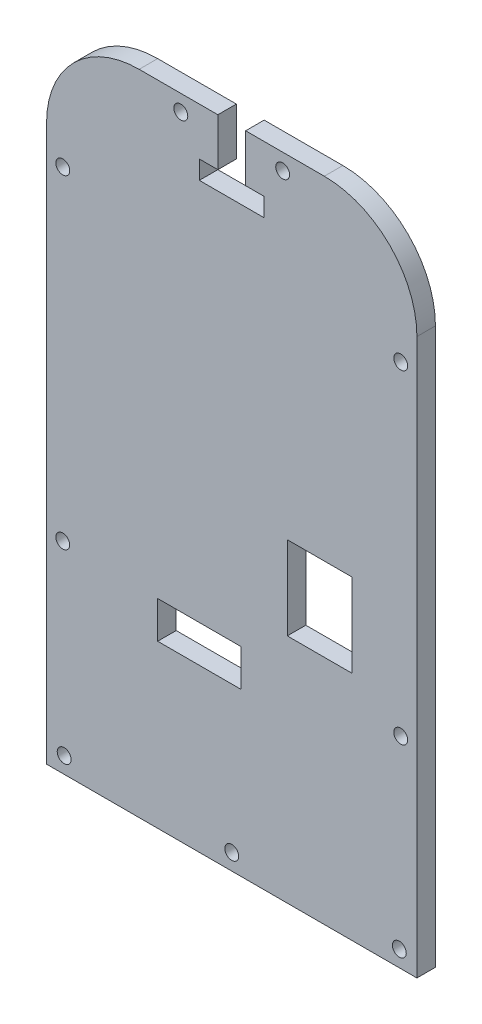
ISO-10303-21;
HEADER;
FILE_DESCRIPTION(('STEP AP214'),'2;1');
FILE_NAME('part.step','',(''),(''),'','','');
FILE_SCHEMA(('AUTOMOTIVE_DESIGN { 1 0 10303 214 1 1 1 1 }'));
ENDSEC;
DATA;
#1=APPLICATION_CONTEXT('core data for automotive mechanical design processes');
#2=APPLICATION_PROTOCOL_DEFINITION('international standard','automotive_design',2000,#1);
#3=PRODUCT_CONTEXT('',#1,'mechanical');
#4=PRODUCT('Part','Part','',(#3));
#5=PRODUCT_RELATED_PRODUCT_CATEGORY('part','',(#4));
#6=PRODUCT_DEFINITION_FORMATION('','',#4);
#7=PRODUCT_DEFINITION_CONTEXT('part definition',#1,'design');
#8=PRODUCT_DEFINITION('design','',#6,#7);
#9=PRODUCT_DEFINITION_SHAPE('','',#8);
#10=(LENGTH_UNIT() NAMED_UNIT(*) SI_UNIT(.MILLI.,.METRE.));
#11=(NAMED_UNIT(*) PLANE_ANGLE_UNIT() SI_UNIT($,.RADIAN.));
#12=(NAMED_UNIT(*) SI_UNIT($,.STERADIAN.) SOLID_ANGLE_UNIT());
#13=UNCERTAINTY_MEASURE_WITH_UNIT(LENGTH_MEASURE(1.E-05),#10,'distance_accuracy_value','');
#14=(GEOMETRIC_REPRESENTATION_CONTEXT(3) GLOBAL_UNCERTAINTY_ASSIGNED_CONTEXT((#13)) GLOBAL_UNIT_ASSIGNED_CONTEXT((#10,
#11,#12)) REPRESENTATION_CONTEXT('',''));
#15=CARTESIAN_POINT('',(0.,0.,0.));
#16=DIRECTION('',(0.,0.,1.));
#17=DIRECTION('',(1.,0.,0.));
#18=AXIS2_PLACEMENT_3D('',#15,#16,#17);
#19=CARTESIAN_POINT('',(-19.9161820854206,25.8355437665783,2.));
#20=DIRECTION('',(0.,-1.,0.));
#21=DIRECTION('',(0.,0.,-1.));
#22=AXIS2_PLACEMENT_3D('',#19,#20,#21);
#23=PLANE('',#22);
#24=DIRECTION('',(-1.,0.,0.));
#25=VECTOR('',#24,1.);
#26=CARTESIAN_POINT('',(-19.9161820854206,25.8355437665783,0.));
#27=LINE('',#26,#25);
#28=CARTESIAN_POINT('',(10.0838179145794,25.8355437665783,0.));
#29=VERTEX_POINT('',#28);
#30=CARTESIAN_POINT('',(1.58381791457943,25.8355437665783,0.));
#31=VERTEX_POINT('',#30);
#32=EDGE_CURVE('E353',#29,#31,#27,.T.);
#33=ORIENTED_EDGE('',*,*,#32,.T.);
#34=DIRECTION('',(0.,0.,-1.));
#35=VECTOR('',#34,1.);
#36=CARTESIAN_POINT('',(1.58381791457943,25.8355437665783,2.001));
#37=LINE('',#36,#35);
#38=CARTESIAN_POINT('',(1.58381791457943,25.8355437665783,2.));
#39=VERTEX_POINT('',#38);
#40=EDGE_CURVE('E238',#39,#31,#37,.T.);
#41=ORIENTED_EDGE('',*,*,#40,.F.);
#42=DIRECTION('',(-1.,0.,0.));
#43=VECTOR('',#42,1.);
#44=CARTESIAN_POINT('',(-19.9161820854206,25.8355437665783,2.));
#45=LINE('',#44,#43);
#46=CARTESIAN_POINT('',(10.0838179145794,25.8355437665783,2.));
#47=VERTEX_POINT('',#46);
#48=EDGE_CURVE('E221',#47,#39,#45,.T.);
#49=ORIENTED_EDGE('',*,*,#48,.F.);
#50=DIRECTION('',(0.,0.,-1.));
#51=VECTOR('',#50,1.);
#52=CARTESIAN_POINT('',(10.0838179145794,25.8355437665783,2.));
#53=LINE('',#52,#51);
#54=EDGE_CURVE('E395',#47,#29,#53,.T.);
#55=ORIENTED_EDGE('',*,*,#54,.T.);
#56=EDGE_LOOP('',(#33,#41,#49,#55));
#57=FACE_BOUND('',#56,.T.);
#58=ADVANCED_FACE('F51',(#57),#23,.F.);
#59=CARTESIAN_POINT('',(3.58381791457943,20.6973968362049,2.001));
#60=DIRECTION('',(0.,1.,0.));
#61=DIRECTION('',(0.,0.,1.));
#62=AXIS2_PLACEMENT_3D('',#59,#60,#61);
#63=PLANE('',#62);
#64=DIRECTION('',(1.,0.,0.));
#65=VECTOR('',#64,1.);
#66=CARTESIAN_POINT('',(3.58381791457943,20.6973968362049,2.));
#67=LINE('',#66,#65);
#68=CARTESIAN_POINT('',(1.58381791457943,20.6973968362049,2.));
#69=VERTEX_POINT('',#68);
#70=CARTESIAN_POINT('',(3.58381791457943,20.6973968362049,2.));
#71=VERTEX_POINT('',#70);
#72=EDGE_CURVE('E218',#69,#71,#67,.T.);
#73=ORIENTED_EDGE('',*,*,#72,.F.);
#74=DIRECTION('',(0.,0.,-1.));
#75=VECTOR('',#74,1.);
#76=CARTESIAN_POINT('',(1.58381791457943,20.6973968362049,2.001));
#77=LINE('',#76,#75);
#78=CARTESIAN_POINT('',(1.58381791457943,20.6973968362049,0.));
#79=VERTEX_POINT('',#78);
#80=EDGE_CURVE('E199',#69,#79,#77,.T.);
#81=ORIENTED_EDGE('',*,*,#80,.T.);
#82=DIRECTION('',(1.,0.,0.));
#83=VECTOR('',#82,1.);
#84=CARTESIAN_POINT('',(3.58381791457943,20.6973968362049,0.));
#85=LINE('',#84,#83);
#86=CARTESIAN_POINT('',(3.58381791457943,20.6973968362049,0.));
#87=VERTEX_POINT('',#86);
#88=EDGE_CURVE('E255',#79,#87,#85,.T.);
#89=ORIENTED_EDGE('',*,*,#88,.T.);
#90=DIRECTION('',(0.,0.,-1.));
#91=VECTOR('',#90,1.);
#92=CARTESIAN_POINT('',(3.58381791457943,20.6973968362049,2.001));
#93=LINE('',#92,#91);
#94=EDGE_CURVE('E228',#71,#87,#93,.T.);
#95=ORIENTED_EDGE('',*,*,#94,.F.);
#96=EDGE_LOOP('',(#73,#81,#89,#95));
#97=FACE_BOUND('',#96,.T.);
#98=ADVANCED_FACE('F226',(#97),#63,.F.);
#99=CARTESIAN_POINT('',(-19.9161820854206,25.8355437665783,2.));
#100=DIRECTION('',(1.,0.,0.));
#101=DIRECTION('',(0.,1.,0.));
#102=AXIS2_PLACEMENT_3D('',#99,#100,#101);
#103=PLANE('',#102);
#104=DIRECTION('',(0.,-1.,0.));
#105=VECTOR('',#104,1.);
#106=CARTESIAN_POINT('',(-19.9161820854206,25.8355437665783,2.));
#107=LINE('',#106,#105);
#108=CARTESIAN_POINT('',(-19.9161820854206,15.8355437665783,2.));
#109=VERTEX_POINT('',#108);
#110=CARTESIAN_POINT('',(-19.9161820854206,-44.1644562334218,2.));
#111=VERTEX_POINT('',#110);
#112=EDGE_CURVE('E349',#109,#111,#107,.T.);
#113=ORIENTED_EDGE('',*,*,#112,.F.);
#114=DIRECTION('',(0.,0.,-1.));
#115=VECTOR('',#114,1.);
#116=CARTESIAN_POINT('',(-19.9161820854206,15.8355437665783,2.));
#117=LINE('',#116,#115);
#118=CARTESIAN_POINT('',(-19.9161820854206,15.8355437665783,0.));
#119=VERTEX_POINT('',#118);
#120=EDGE_CURVE('E384',#109,#119,#117,.T.);
#121=ORIENTED_EDGE('',*,*,#120,.T.);
#122=DIRECTION('',(0.,-1.,0.));
#123=VECTOR('',#122,1.);
#124=CARTESIAN_POINT('',(-19.9161820854206,25.8355437665783,0.));
#125=LINE('',#124,#123);
#126=CARTESIAN_POINT('',(-19.9161820854206,-44.1644562334218,0.));
#127=VERTEX_POINT('',#126);
#128=EDGE_CURVE('E345',#119,#127,#125,.T.);
#129=ORIENTED_EDGE('',*,*,#128,.T.);
#130=DIRECTION('',(0.,0.,-1.));
#131=VECTOR('',#130,1.);
#132=CARTESIAN_POINT('',(-19.9161820854206,-44.1644562334218,2.));
#133=LINE('',#132,#131);
#134=EDGE_CURVE('E380',#111,#127,#133,.T.);
#135=ORIENTED_EDGE('',*,*,#134,.F.);
#136=EDGE_LOOP('',(#113,#121,#129,#135));
#137=FACE_BOUND('',#136,.T.);
#138=ADVANCED_FACE('F416',(#137),#103,.F.);
#139=CARTESIAN_POINT('',(-19.9161820854206,-44.1644562334218,2.));
#140=DIRECTION('',(0.,1.,0.));
#141=DIRECTION('',(0.,0.,1.));
#142=AXIS2_PLACEMENT_3D('',#139,#140,#141);
#143=PLANE('',#142);
#144=DIRECTION('',(1.,0.,0.));
#145=VECTOR('',#144,1.);
#146=CARTESIAN_POINT('',(-19.9161820854206,-44.1644562334218,0.));
#147=LINE('',#146,#145);
#148=CARTESIAN_POINT('',(20.0838179145794,-44.1644562334218,0.));
#149=VERTEX_POINT('',#148);
#150=EDGE_CURVE('E366',#127,#149,#147,.T.);
#151=ORIENTED_EDGE('',*,*,#150,.T.);
#152=DIRECTION('',(0.,0.,-1.));
#153=VECTOR('',#152,1.);
#154=CARTESIAN_POINT('',(20.0838179145794,-44.1644562334218,2.));
#155=LINE('',#154,#153);
#156=CARTESIAN_POINT('',(20.0838179145794,-44.1644562334218,2.));
#157=VERTEX_POINT('',#156);
#158=EDGE_CURVE('E363',#157,#149,#155,.T.);
#159=ORIENTED_EDGE('',*,*,#158,.F.);
#160=DIRECTION('',(1.,0.,0.));
#161=VECTOR('',#160,1.);
#162=CARTESIAN_POINT('',(-19.9161820854206,-44.1644562334218,2.));
#163=LINE('',#162,#161);
#164=EDGE_CURVE('E352',#111,#157,#163,.T.);
#165=ORIENTED_EDGE('',*,*,#164,.F.);
#166=ORIENTED_EDGE('',*,*,#134,.T.);
#167=EDGE_LOOP('',(#151,#159,#165,#166));
#168=FACE_BOUND('',#167,.T.);
#169=ADVANCED_FACE('F427',(#168),#143,.F.);
#170=CARTESIAN_POINT('',(20.0838179145794,25.8355437665783,2.));
#171=DIRECTION('',(-1.,0.,0.));
#172=DIRECTION('',(0.,-1.,0.));
#173=AXIS2_PLACEMENT_3D('',#170,#171,#172);
#174=PLANE('',#173);
#175=DIRECTION('',(0.,1.,0.));
#176=VECTOR('',#175,1.);
#177=CARTESIAN_POINT('',(20.0838179145794,25.8355437665783,0.));
#178=LINE('',#177,#176);
#179=CARTESIAN_POINT('',(20.0838179145794,15.8355437665783,0.));
#180=VERTEX_POINT('',#179);
#181=EDGE_CURVE('E369',#149,#180,#178,.T.);
#182=ORIENTED_EDGE('',*,*,#181,.T.);
#183=DIRECTION('',(0.,0.,-1.));
#184=VECTOR('',#183,1.);
#185=CARTESIAN_POINT('',(20.0838179145794,15.8355437665783,2.));
#186=LINE('',#185,#184);
#187=CARTESIAN_POINT('',(20.0838179145794,15.8355437665783,2.));
#188=VERTEX_POINT('',#187);
#189=EDGE_CURVE('E11',#180,#188,#186,.F.);
#190=ORIENTED_EDGE('',*,*,#189,.T.);
#191=DIRECTION('',(0.,1.,0.));
#192=VECTOR('',#191,1.);
#193=CARTESIAN_POINT('',(20.0838179145794,25.8355437665783,2.));
#194=LINE('',#193,#192);
#195=EDGE_CURVE('E356',#157,#188,#194,.T.);
#196=ORIENTED_EDGE('',*,*,#195,.F.);
#197=ORIENTED_EDGE('',*,*,#158,.T.);
#198=EDGE_LOOP('',(#182,#190,#196,#197));
#199=FACE_BOUND('',#198,.T.);
#200=ADVANCED_FACE('F598',(#199),#174,.F.);
#201=CARTESIAN_POINT('',(-1.41618208542058,25.8355437665783,2.));
#202=VERTEX_POINT('',#201);
#203=CARTESIAN_POINT('',(-9.91618208542057,25.8355437665783,2.));
#204=VERTEX_POINT('',#203);
#205=EDGE_CURVE('E360',#202,#204,#45,.T.);
#206=ORIENTED_EDGE('',*,*,#205,.F.);
#207=DIRECTION('',(0.,0.,-1.));
#208=VECTOR('',#207,1.);
#209=CARTESIAN_POINT('',(-1.41618208542057,25.8355437665783,2.001));
#210=LINE('',#209,#208);
#211=CARTESIAN_POINT('',(-1.41618208542057,25.8355437665783,0.));
#212=VERTEX_POINT('',#211);
#213=EDGE_CURVE('E445',#202,#212,#210,.T.);
#214=ORIENTED_EDGE('',*,*,#213,.T.);
#215=CARTESIAN_POINT('',(-9.91618208542057,25.8355437665783,0.));
#216=VERTEX_POINT('',#215);
#217=EDGE_CURVE('E373',#212,#216,#27,.T.);
#218=ORIENTED_EDGE('',*,*,#217,.T.);
#219=DIRECTION('',(0.,0.,-1.));
#220=VECTOR('',#219,1.);
#221=CARTESIAN_POINT('',(-9.91618208542057,25.8355437665783,2.));
#222=LINE('',#221,#220);
#223=EDGE_CURVE('E399',#216,#204,#222,.F.);
#224=ORIENTED_EDGE('',*,*,#223,.T.);
#225=EDGE_LOOP('',(#206,#214,#218,#224));
#226=FACE_BOUND('',#225,.T.);
#227=ADVANCED_FACE('F589',(#226),#23,.F.);
#228=CARTESIAN_POINT('',(0.,0.,2.));
#229=DIRECTION('',(0.,0.,1.));
#230=DIRECTION('',(1.,0.,0.));
#231=AXIS2_PLACEMENT_3D('',#228,#229,#230);
#232=PLANE('',#231);
#233=DIRECTION('',(0.,-1.,0.));
#234=VECTOR('',#233,1.);
#235=CARTESIAN_POINT('',(1.58381791457943,20.6973968362049,2.));
#236=LINE('',#235,#234);
#237=EDGE_CURVE('E202',#39,#69,#236,.T.);
#238=ORIENTED_EDGE('',*,*,#237,.T.);
#239=ORIENTED_EDGE('',*,*,#72,.T.);
#240=DIRECTION('',(0.,-1.,0.));
#241=VECTOR('',#240,1.);
#242=CARTESIAN_POINT('',(3.58381791457943,20.6973968362049,2.));
#243=LINE('',#242,#241);
#244=CARTESIAN_POINT('',(3.58381791457943,18.6973968362049,2.));
#245=VERTEX_POINT('',#244);
#246=EDGE_CURVE('E236',#71,#245,#243,.T.);
#247=ORIENTED_EDGE('',*,*,#246,.T.);
#248=DIRECTION('',(-1.,0.,0.));
#249=VECTOR('',#248,1.);
#250=CARTESIAN_POINT('',(3.58381791457943,18.6973968362049,2.));
#251=LINE('',#250,#249);
#252=CARTESIAN_POINT('',(-3.41618208542058,18.6973968362049,2.));
#253=VERTEX_POINT('',#252);
#254=EDGE_CURVE('E263',#245,#253,#251,.T.);
#255=ORIENTED_EDGE('',*,*,#254,.T.);
#256=DIRECTION('',(0.,1.,0.));
#257=VECTOR('',#256,1.);
#258=CARTESIAN_POINT('',(-3.41618208542057,20.6973968362049,2.));
#259=LINE('',#258,#257);
#260=CARTESIAN_POINT('',(-3.41618208542057,20.6973968362049,2.));
#261=VERTEX_POINT('',#260);
#262=EDGE_CURVE('E231',#253,#261,#259,.T.);
#263=ORIENTED_EDGE('',*,*,#262,.T.);
#264=CARTESIAN_POINT('',(-1.41618208542058,20.6973968362049,2.));
#265=VERTEX_POINT('',#264);
#266=EDGE_CURVE('E230',#261,#265,#67,.T.);
#267=ORIENTED_EDGE('',*,*,#266,.T.);
#268=DIRECTION('',(0.,1.,0.));
#269=VECTOR('',#268,1.);
#270=CARTESIAN_POINT('',(-1.41618208542057,20.6973968362049,2.));
#271=LINE('',#270,#269);
#272=EDGE_CURVE('E223',#265,#202,#271,.T.);
#273=ORIENTED_EDGE('',*,*,#272,.T.);
#274=ORIENTED_EDGE('',*,*,#205,.T.);
#275=CARTESIAN_POINT('',(-9.91618208542057,15.8355437665783,2.));
#276=DIRECTION('',(0.,0.,1.));
#277=DIRECTION('',(1.,0.,0.));
#278=AXIS2_PLACEMENT_3D('',#275,#276,#277);
#279=CIRCLE('',#278,10.);
#280=EDGE_CURVE('E60',#204,#109,#279,.T.);
#281=ORIENTED_EDGE('',*,*,#280,.T.);
#282=ORIENTED_EDGE('',*,*,#112,.T.);
#283=ORIENTED_EDGE('',*,*,#164,.T.);
#284=ORIENTED_EDGE('',*,*,#195,.T.);
#285=CARTESIAN_POINT('',(10.0838179145794,15.8355437665783,2.));
#286=DIRECTION('',(0.,0.,1.));
#287=DIRECTION('',(1.,0.,0.));
#288=AXIS2_PLACEMENT_3D('',#285,#286,#287);
#289=CIRCLE('',#288,10.);
#290=EDGE_CURVE('E403',#188,#47,#289,.T.);
#291=ORIENTED_EDGE('',*,*,#290,.T.);
#292=ORIENTED_EDGE('',*,*,#48,.T.);
#293=EDGE_LOOP('',(#238,#239,#247,#255,#263,#267,#273,#274,#281,#282,#283,#284,#291,#292));
#294=FACE_BOUND('',#293,.T.);
#295=DIRECTION('',(0.,-1.,0.));
#296=VECTOR('',#295,1.);
#297=CARTESIAN_POINT('',(13.0838179145794,-10.1644562334218,2.));
#298=LINE('',#297,#296);
#299=CARTESIAN_POINT('',(13.0838179145794,-10.1644562334218,2.));
#300=VERTEX_POINT('',#299);
#301=CARTESIAN_POINT('',(13.0838179145794,-19.1644562334218,2.));
#302=VERTEX_POINT('',#301);
#303=EDGE_CURVE('E482',#300,#302,#298,.T.);
#304=ORIENTED_EDGE('',*,*,#303,.T.);
#305=DIRECTION('',(-1.,0.,0.));
#306=VECTOR('',#305,1.);
#307=CARTESIAN_POINT('',(13.0838179145794,-19.1644562334218,2.));
#308=LINE('',#307,#306);
#309=CARTESIAN_POINT('',(6.08381791457943,-19.1644562334218,2.));
#310=VERTEX_POINT('',#309);
#311=EDGE_CURVE('E451',#302,#310,#308,.T.);
#312=ORIENTED_EDGE('',*,*,#311,.T.);
#313=DIRECTION('',(0.,1.,0.));
#314=VECTOR('',#313,1.);
#315=CARTESIAN_POINT('',(6.08381791457943,-10.1644562334218,2.));
#316=LINE('',#315,#314);
#317=CARTESIAN_POINT('',(6.08381791457943,-10.1644562334218,2.));
#318=VERTEX_POINT('',#317);
#319=EDGE_CURVE('E490',#310,#318,#316,.T.);
#320=ORIENTED_EDGE('',*,*,#319,.T.);
#321=DIRECTION('',(1.,0.,0.));
#322=VECTOR('',#321,1.);
#323=CARTESIAN_POINT('',(13.0838179145794,-10.1644562334218,2.));
#324=LINE('',#323,#322);
#325=EDGE_CURVE('E486',#318,#300,#324,.T.);
#326=ORIENTED_EDGE('',*,*,#325,.T.);
#327=EDGE_LOOP('',(#304,#312,#320,#326));
#328=FACE_BOUND('',#327,.T.);
#329=DIRECTION('',(0.,-1.,0.));
#330=VECTOR('',#329,1.);
#331=CARTESIAN_POINT('',(1.08381791457943,-22.6644562334218,2.));
#332=LINE('',#331,#330);
#333=CARTESIAN_POINT('',(1.08381791457943,-22.6644562334218,2.));
#334=VERTEX_POINT('',#333);
#335=CARTESIAN_POINT('',(1.08381791457943,-26.6644562334218,2.));
#336=VERTEX_POINT('',#335);
#337=EDGE_CURVE('E524',#334,#336,#332,.T.);
#338=ORIENTED_EDGE('',*,*,#337,.T.);
#339=DIRECTION('',(-1.,0.,0.));
#340=VECTOR('',#339,1.);
#341=CARTESIAN_POINT('',(1.08381791457943,-26.6644562334218,2.));
#342=LINE('',#341,#340);
#343=CARTESIAN_POINT('',(-7.91618208542057,-26.6644562334218,2.));
#344=VERTEX_POINT('',#343);
#345=EDGE_CURVE('E494',#336,#344,#342,.T.);
#346=ORIENTED_EDGE('',*,*,#345,.T.);
#347=DIRECTION('',(0.,1.,0.));
#348=VECTOR('',#347,1.);
#349=CARTESIAN_POINT('',(-7.91618208542057,-22.6644562334218,2.));
#350=LINE('',#349,#348);
#351=CARTESIAN_POINT('',(-7.91618208542057,-22.6644562334218,2.));
#352=VERTEX_POINT('',#351);
#353=EDGE_CURVE('E456',#344,#352,#350,.T.);
#354=ORIENTED_EDGE('',*,*,#353,.T.);
#355=DIRECTION('',(1.,0.,0.));
#356=VECTOR('',#355,1.);
#357=CARTESIAN_POINT('',(1.08381791457943,-22.6644562334218,2.));
#358=LINE('',#357,#356);
#359=EDGE_CURVE('E528',#352,#334,#358,.T.);
#360=ORIENTED_EDGE('',*,*,#359,.T.);
#361=EDGE_LOOP('',(#338,#346,#354,#360));
#362=FACE_BOUND('',#361,.T.);
#363=CARTESIAN_POINT('',(-18.0161820854206,-42.4144562334218,2.));
#364=DIRECTION('',(0.,0.,1.));
#365=DIRECTION('',(1.,0.,0.));
#366=AXIS2_PLACEMENT_3D('',#363,#364,#365);
#367=CIRCLE('',#366,0.750000000000002);
#368=CARTESIAN_POINT('',(-17.2661820854206,-42.4144562334218,2.));
#369=VERTEX_POINT('',#368);
#370=EDGE_CURVE('E318',#369,#369,#367,.F.);
#371=ORIENTED_EDGE('',*,*,#370,.T.);
#372=EDGE_LOOP('',(#371));
#373=FACE_BOUND('',#372,.T.);
#374=CARTESIAN_POINT('',(0.0838179145794329,-42.4144562334218,2.));
#375=DIRECTION('',(0.,0.,1.));
#376=DIRECTION('',(1.,0.,0.));
#377=AXIS2_PLACEMENT_3D('',#374,#375,#376);
#378=CIRCLE('',#377,0.750000000000001);
#379=CARTESIAN_POINT('',(0.833817914579434,-42.4144562334218,2.));
#380=VERTEX_POINT('',#379);
#381=EDGE_CURVE('E309',#380,#380,#378,.F.);
#382=ORIENTED_EDGE('',*,*,#381,.T.);
#383=EDGE_LOOP('',(#382));
#384=FACE_BOUND('',#383,.T.);
#385=CARTESIAN_POINT('',(18.1838179145794,-42.4144562334218,2.));
#386=DIRECTION('',(0.,0.,1.));
#387=DIRECTION('',(1.,0.,0.));
#388=AXIS2_PLACEMENT_3D('',#385,#386,#387);
#389=CIRCLE('',#388,0.750000000000002);
#390=CARTESIAN_POINT('',(18.9338179145794,-42.4144562334218,2.));
#391=VERTEX_POINT('',#390);
#392=EDGE_CURVE('E334',#391,#391,#389,.F.);
#393=ORIENTED_EDGE('',*,*,#392,.T.);
#394=EDGE_LOOP('',(#393));
#395=FACE_BOUND('',#394,.T.);
#396=CARTESIAN_POINT('',(-5.41618208542057,24.0855437665783,2.));
#397=DIRECTION('',(0.,0.,1.));
#398=DIRECTION('',(1.,0.,0.));
#399=AXIS2_PLACEMENT_3D('',#396,#397,#398);
#400=CIRCLE('',#399,0.75);
#401=CARTESIAN_POINT('',(-4.66618208542057,24.0855437665783,2.));
#402=VERTEX_POINT('',#401);
#403=EDGE_CURVE('E325',#402,#402,#400,.F.);
#404=ORIENTED_EDGE('',*,*,#403,.T.);
#405=EDGE_LOOP('',(#404));
#406=FACE_BOUND('',#405,.T.);
#407=CARTESIAN_POINT('',(18.3338179145794,12.5855437665782,2.));
#408=DIRECTION('',(0.,0.,1.));
#409=DIRECTION('',(1.,0.,0.));
#410=AXIS2_PLACEMENT_3D('',#407,#408,#409);
#411=CIRCLE('',#410,0.750000000000002);
#412=CARTESIAN_POINT('',(19.0838179145794,12.5855437665782,2.));
#413=VERTEX_POINT('',#412);
#414=EDGE_CURVE('E277',#413,#413,#411,.F.);
#415=ORIENTED_EDGE('',*,*,#414,.T.);
#416=EDGE_LOOP('',(#415));
#417=FACE_BOUND('',#416,.T.);
#418=CARTESIAN_POINT('',(18.3338179145794,-22.4144562334218,2.));
#419=DIRECTION('',(0.,0.,1.));
#420=DIRECTION('',(1.,0.,0.));
#421=AXIS2_PLACEMENT_3D('',#418,#419,#420);
#422=CIRCLE('',#421,0.750000000000002);
#423=CARTESIAN_POINT('',(19.0838179145794,-22.4144562334218,2.));
#424=VERTEX_POINT('',#423);
#425=EDGE_CURVE('E286',#424,#424,#422,.F.);
#426=ORIENTED_EDGE('',*,*,#425,.T.);
#427=EDGE_LOOP('',(#426));
#428=FACE_BOUND('',#427,.T.);
#429=CARTESIAN_POINT('',(-18.1661820854206,12.5855437665782,2.));
#430=DIRECTION('',(0.,0.,1.));
#431=DIRECTION('',(1.,0.,0.));
#432=AXIS2_PLACEMENT_3D('',#429,#430,#431);
#433=CIRCLE('',#432,0.750000000000002);
#434=CARTESIAN_POINT('',(-17.4161820854206,12.5855437665782,2.));
#435=VERTEX_POINT('',#434);
#436=EDGE_CURVE('E294',#435,#435,#433,.F.);
#437=ORIENTED_EDGE('',*,*,#436,.T.);
#438=EDGE_LOOP('',(#437));
#439=FACE_BOUND('',#438,.T.);
#440=CARTESIAN_POINT('',(-18.1661820854206,-22.4144562334218,2.));
#441=DIRECTION('',(0.,0.,1.));
#442=DIRECTION('',(1.,0.,0.));
#443=AXIS2_PLACEMENT_3D('',#440,#441,#442);
#444=CIRCLE('',#443,0.750000000000002);
#445=CARTESIAN_POINT('',(-17.4161820854206,-22.4144562334218,2.));
#446=VERTEX_POINT('',#445);
#447=EDGE_CURVE('E302',#446,#446,#444,.F.);
#448=ORIENTED_EDGE('',*,*,#447,.T.);
#449=EDGE_LOOP('',(#448));
#450=FACE_BOUND('',#449,.T.);
#451=CARTESIAN_POINT('',(5.58381791457943,24.0855437665782,2.));
#452=DIRECTION('',(0.,0.,1.));
#453=DIRECTION('',(1.,0.,0.));
#454=AXIS2_PLACEMENT_3D('',#451,#452,#453);
#455=CIRCLE('',#454,0.75);
#456=CARTESIAN_POINT('',(6.33381791457943,24.0855437665782,2.));
#457=VERTEX_POINT('',#456);
#458=EDGE_CURVE('E329',#457,#457,#455,.F.);
#459=ORIENTED_EDGE('',*,*,#458,.T.);
#460=EDGE_LOOP('',(#459));
#461=FACE_BOUND('',#460,.T.);
#462=ADVANCED_FACE('F215',(#294,#328,#362,#373,#384,#395,#406,#417,#428,#439,#450,#461),#232,.T.);
#463=CARTESIAN_POINT('',(0.,0.,0.));
#464=DIRECTION('',(0.,0.,1.));
#465=DIRECTION('',(1.,0.,0.));
#466=AXIS2_PLACEMENT_3D('',#463,#464,#465);
#467=PLANE('',#466);
#468=DIRECTION('',(-1.,0.,0.));
#469=VECTOR('',#468,1.);
#470=CARTESIAN_POINT('',(13.0838179145794,-19.1644562334218,0.));
#471=LINE('',#470,#469);
#472=CARTESIAN_POINT('',(13.0838179145794,-19.1644562334218,0.));
#473=VERTEX_POINT('',#472);
#474=CARTESIAN_POINT('',(6.08381791457943,-19.1644562334218,0.));
#475=VERTEX_POINT('',#474);
#476=EDGE_CURVE('E476',#473,#475,#471,.T.);
#477=ORIENTED_EDGE('',*,*,#476,.F.);
#478=DIRECTION('',(0.,-1.,0.));
#479=VECTOR('',#478,1.);
#480=CARTESIAN_POINT('',(13.0838179145794,-10.1644562334218,0.));
#481=LINE('',#480,#479);
#482=CARTESIAN_POINT('',(13.0838179145794,-10.1644562334218,0.));
#483=VERTEX_POINT('',#482);
#484=EDGE_CURVE('E479',#483,#473,#481,.T.);
#485=ORIENTED_EDGE('',*,*,#484,.F.);
#486=DIRECTION('',(1.,0.,0.));
#487=VECTOR('',#486,1.);
#488=CARTESIAN_POINT('',(13.0838179145794,-10.1644562334218,0.));
#489=LINE('',#488,#487);
#490=CARTESIAN_POINT('',(6.08381791457943,-10.1644562334218,0.));
#491=VERTEX_POINT('',#490);
#492=EDGE_CURVE('E461',#491,#483,#489,.T.);
#493=ORIENTED_EDGE('',*,*,#492,.F.);
#494=DIRECTION('',(0.,1.,0.));
#495=VECTOR('',#494,1.);
#496=CARTESIAN_POINT('',(6.08381791457943,-10.1644562334218,0.));
#497=LINE('',#496,#495);
#498=EDGE_CURVE('E472',#475,#491,#497,.T.);
#499=ORIENTED_EDGE('',*,*,#498,.F.);
#500=EDGE_LOOP('',(#477,#485,#493,#499));
#501=FACE_BOUND('',#500,.T.);
#502=DIRECTION('',(-1.,0.,0.));
#503=VECTOR('',#502,1.);
#504=CARTESIAN_POINT('',(1.08381791457943,-26.6644562334218,0.));
#505=LINE('',#504,#503);
#506=CARTESIAN_POINT('',(1.08381791457943,-26.6644562334218,0.));
#507=VERTEX_POINT('',#506);
#508=CARTESIAN_POINT('',(-7.91618208542057,-26.6644562334218,0.));
#509=VERTEX_POINT('',#508);
#510=EDGE_CURVE('E518',#507,#509,#505,.T.);
#511=ORIENTED_EDGE('',*,*,#510,.F.);
#512=DIRECTION('',(0.,-1.,0.));
#513=VECTOR('',#512,1.);
#514=CARTESIAN_POINT('',(1.08381791457943,-22.6644562334218,0.));
#515=LINE('',#514,#513);
#516=CARTESIAN_POINT('',(1.08381791457943,-22.6644562334218,0.));
#517=VERTEX_POINT('',#516);
#518=EDGE_CURVE('E521',#517,#507,#515,.T.);
#519=ORIENTED_EDGE('',*,*,#518,.F.);
#520=DIRECTION('',(1.,0.,0.));
#521=VECTOR('',#520,1.);
#522=CARTESIAN_POINT('',(1.08381791457943,-22.6644562334218,0.));
#523=LINE('',#522,#521);
#524=CARTESIAN_POINT('',(-7.91618208542057,-22.6644562334218,0.));
#525=VERTEX_POINT('',#524);
#526=EDGE_CURVE('E503',#525,#517,#523,.T.);
#527=ORIENTED_EDGE('',*,*,#526,.F.);
#528=DIRECTION('',(0.,1.,0.));
#529=VECTOR('',#528,1.);
#530=CARTESIAN_POINT('',(-7.91618208542057,-22.6644562334218,0.));
#531=LINE('',#530,#529);
#532=EDGE_CURVE('E514',#509,#525,#531,.T.);
#533=ORIENTED_EDGE('',*,*,#532,.F.);
#534=EDGE_LOOP('',(#511,#519,#527,#533));
#535=FACE_BOUND('',#534,.T.);
#536=CARTESIAN_POINT('',(-18.0161820854206,-42.4144562334218,0.));
#537=DIRECTION('',(0.,0.,-1.));
#538=DIRECTION('',(-1.,0.,0.));
#539=AXIS2_PLACEMENT_3D('',#536,#537,#538);
#540=CIRCLE('',#539,0.750000000000002);
#541=CARTESIAN_POINT('',(-18.7661820854206,-42.4144562334218,0.));
#542=VERTEX_POINT('',#541);
#543=EDGE_CURVE('E281',#542,#542,#540,.T.);
#544=ORIENTED_EDGE('',*,*,#543,.F.);
#545=EDGE_LOOP('',(#544));
#546=FACE_BOUND('',#545,.T.);
#547=CARTESIAN_POINT('',(0.0838179145794329,-42.4144562334218,0.));
#548=DIRECTION('',(0.,0.,-1.));
#549=DIRECTION('',(-1.,0.,0.));
#550=AXIS2_PLACEMENT_3D('',#547,#548,#549);
#551=CIRCLE('',#550,0.750000000000001);
#552=CARTESIAN_POINT('',(-0.666182085420568,-42.4144562334218,0.));
#553=VERTEX_POINT('',#552);
#554=EDGE_CURVE('E314',#553,#553,#551,.T.);
#555=ORIENTED_EDGE('',*,*,#554,.F.);
#556=EDGE_LOOP('',(#555));
#557=FACE_BOUND('',#556,.T.);
#558=CARTESIAN_POINT('',(18.1838179145794,-42.4144562334218,0.));
#559=DIRECTION('',(0.,0.,-1.));
#560=DIRECTION('',(-1.,0.,0.));
#561=AXIS2_PLACEMENT_3D('',#558,#559,#560);
#562=CIRCLE('',#561,0.750000000000002);
#563=CARTESIAN_POINT('',(17.4338179145794,-42.4144562334218,0.));
#564=VERTEX_POINT('',#563);
#565=EDGE_CURVE('E313',#564,#564,#562,.T.);
#566=ORIENTED_EDGE('',*,*,#565,.F.);
#567=EDGE_LOOP('',(#566));
#568=FACE_BOUND('',#567,.T.);
#569=CARTESIAN_POINT('',(-5.41618208542057,24.0855437665783,0.));
#570=DIRECTION('',(0.,0.,-1.));
#571=DIRECTION('',(-1.,0.,0.));
#572=AXIS2_PLACEMENT_3D('',#569,#570,#571);
#573=CIRCLE('',#572,0.75);
#574=CARTESIAN_POINT('',(-6.16618208542057,24.0855437665783,0.));
#575=VERTEX_POINT('',#574);
#576=EDGE_CURVE('E330',#575,#575,#573,.T.);
#577=ORIENTED_EDGE('',*,*,#576,.F.);
#578=EDGE_LOOP('',(#577));
#579=FACE_BOUND('',#578,.T.);
#580=CARTESIAN_POINT('',(18.3338179145794,12.5855437665782,0.));
#581=DIRECTION('',(0.,0.,-1.));
#582=DIRECTION('',(-1.,0.,0.));
#583=AXIS2_PLACEMENT_3D('',#580,#581,#582);
#584=CIRCLE('',#583,0.750000000000002);
#585=CARTESIAN_POINT('',(17.5838179145794,12.5855437665782,0.));
#586=VERTEX_POINT('',#585);
#587=EDGE_CURVE('E282',#586,#586,#584,.T.);
#588=ORIENTED_EDGE('',*,*,#587,.F.);
#589=EDGE_LOOP('',(#588));
#590=FACE_BOUND('',#589,.T.);
#591=CARTESIAN_POINT('',(18.3338179145794,-22.4144562334218,0.));
#592=DIRECTION('',(0.,0.,-1.));
#593=DIRECTION('',(-1.,0.,0.));
#594=AXIS2_PLACEMENT_3D('',#591,#592,#593);
#595=CIRCLE('',#594,0.750000000000002);
#596=CARTESIAN_POINT('',(17.5838179145794,-22.4144562334218,0.));
#597=VERTEX_POINT('',#596);
#598=EDGE_CURVE('E290',#597,#597,#595,.T.);
#599=ORIENTED_EDGE('',*,*,#598,.F.);
#600=EDGE_LOOP('',(#599));
#601=FACE_BOUND('',#600,.T.);
#602=CARTESIAN_POINT('',(-18.1661820854206,12.5855437665782,0.));
#603=DIRECTION('',(0.,0.,-1.));
#604=DIRECTION('',(-1.,0.,0.));
#605=AXIS2_PLACEMENT_3D('',#602,#603,#604);
#606=CIRCLE('',#605,0.750000000000002);
#607=CARTESIAN_POINT('',(-18.9161820854206,12.5855437665782,0.));
#608=VERTEX_POINT('',#607);
#609=EDGE_CURVE('E298',#608,#608,#606,.T.);
#610=ORIENTED_EDGE('',*,*,#609,.F.);
#611=EDGE_LOOP('',(#610));
#612=FACE_BOUND('',#611,.T.);
#613=CARTESIAN_POINT('',(-18.1661820854206,-22.4144562334218,0.));
#614=DIRECTION('',(0.,0.,-1.));
#615=DIRECTION('',(-1.,0.,0.));
#616=AXIS2_PLACEMENT_3D('',#613,#614,#615);
#617=CIRCLE('',#616,0.750000000000002);
#618=CARTESIAN_POINT('',(-18.9161820854206,-22.4144562334218,0.));
#619=VERTEX_POINT('',#618);
#620=EDGE_CURVE('E276',#619,#619,#617,.T.);
#621=ORIENTED_EDGE('',*,*,#620,.F.);
#622=EDGE_LOOP('',(#621));
#623=FACE_BOUND('',#622,.T.);
#624=CARTESIAN_POINT('',(5.58381791457943,24.0855437665782,0.));
#625=DIRECTION('',(0.,0.,-1.));
#626=DIRECTION('',(-1.,0.,0.));
#627=AXIS2_PLACEMENT_3D('',#624,#625,#626);
#628=CIRCLE('',#627,0.75);
#629=CARTESIAN_POINT('',(4.83381791457943,24.0855437665782,0.));
#630=VERTEX_POINT('',#629);
#631=EDGE_CURVE('E341',#630,#630,#628,.T.);
#632=ORIENTED_EDGE('',*,*,#631,.F.);
#633=EDGE_LOOP('',(#632));
#634=FACE_BOUND('',#633,.T.);
#635=ORIENTED_EDGE('',*,*,#88,.F.);
#636=DIRECTION('',(0.,-1.,0.));
#637=VECTOR('',#636,1.);
#638=CARTESIAN_POINT('',(1.58381791457943,20.6973968362049,0.));
#639=LINE('',#638,#637);
#640=EDGE_CURVE('E205',#31,#79,#639,.T.);
#641=ORIENTED_EDGE('',*,*,#640,.F.);
#642=ORIENTED_EDGE('',*,*,#32,.F.);
#643=CARTESIAN_POINT('',(10.0838179145794,15.8355437665783,0.));
#644=DIRECTION('',(0.,0.,1.));
#645=DIRECTION('',(1.,0.,0.));
#646=AXIS2_PLACEMENT_3D('',#643,#644,#645);
#647=CIRCLE('',#646,10.);
#648=EDGE_CURVE('E388',#29,#180,#647,.F.);
#649=ORIENTED_EDGE('',*,*,#648,.T.);
#650=ORIENTED_EDGE('',*,*,#181,.F.);
#651=ORIENTED_EDGE('',*,*,#150,.F.);
#652=ORIENTED_EDGE('',*,*,#128,.F.);
#653=CARTESIAN_POINT('',(-9.91618208542057,15.8355437665783,0.));
#654=DIRECTION('',(0.,0.,1.));
#655=DIRECTION('',(1.,0.,0.));
#656=AXIS2_PLACEMENT_3D('',#653,#654,#655);
#657=CIRCLE('',#656,10.);
#658=EDGE_CURVE('E391',#119,#216,#657,.F.);
#659=ORIENTED_EDGE('',*,*,#658,.T.);
#660=ORIENTED_EDGE('',*,*,#217,.F.);
#661=DIRECTION('',(0.,1.,0.));
#662=VECTOR('',#661,1.);
#663=CARTESIAN_POINT('',(-1.41618208542057,20.6973968362049,0.));
#664=LINE('',#663,#662);
#665=CARTESIAN_POINT('',(-1.41618208542057,20.6973968362049,0.));
#666=VERTEX_POINT('',#665);
#667=EDGE_CURVE('E211',#666,#212,#664,.T.);
#668=ORIENTED_EDGE('',*,*,#667,.F.);
#669=CARTESIAN_POINT('',(-3.41618208542057,20.6973968362049,0.));
#670=VERTEX_POINT('',#669);
#671=EDGE_CURVE('E256',#670,#666,#85,.T.);
#672=ORIENTED_EDGE('',*,*,#671,.F.);
#673=DIRECTION('',(0.,1.,0.));
#674=VECTOR('',#673,1.);
#675=CARTESIAN_POINT('',(-3.41618208542057,20.6973968362049,0.));
#676=LINE('',#675,#674);
#677=CARTESIAN_POINT('',(-3.41618208542058,18.6973968362049,0.));
#678=VERTEX_POINT('',#677);
#679=EDGE_CURVE('E251',#678,#670,#676,.T.);
#680=ORIENTED_EDGE('',*,*,#679,.F.);
#681=DIRECTION('',(-1.,0.,0.));
#682=VECTOR('',#681,1.);
#683=CARTESIAN_POINT('',(3.58381791457943,18.6973968362049,0.));
#684=LINE('',#683,#682);
#685=CARTESIAN_POINT('',(3.58381791457943,18.6973968362049,0.));
#686=VERTEX_POINT('',#685);
#687=EDGE_CURVE('E247',#686,#678,#684,.T.);
#688=ORIENTED_EDGE('',*,*,#687,.F.);
#689=DIRECTION('',(0.,-1.,0.));
#690=VECTOR('',#689,1.);
#691=CARTESIAN_POINT('',(3.58381791457943,20.6973968362049,0.));
#692=LINE('',#691,#690);
#693=EDGE_CURVE('E244',#87,#686,#692,.T.);
#694=ORIENTED_EDGE('',*,*,#693,.F.);
#695=EDGE_LOOP('',(#635,#641,#642,#649,#650,#651,#652,#659,#660,#668,#672,#680,#688,#694));
#696=FACE_BOUND('',#695,.T.);
#697=ADVANCED_FACE('F421',(#501,#535,#546,#557,#568,#579,#590,#601,#612,#623,#634,#696),#467,.F.);
#698=CARTESIAN_POINT('',(-9.91618208542057,15.8355437665783,2.));
#699=DIRECTION('',(0.,0.,-1.));
#700=DIRECTION('',(-1.,0.,0.));
#701=AXIS2_PLACEMENT_3D('',#698,#699,#700);
#702=CYLINDRICAL_SURFACE('',#701,10.);
#703=ORIENTED_EDGE('',*,*,#280,.F.);
#704=ORIENTED_EDGE('',*,*,#223,.F.);
#705=ORIENTED_EDGE('',*,*,#658,.F.);
#706=ORIENTED_EDGE('',*,*,#120,.F.);
#707=EDGE_LOOP('',(#703,#704,#705,#706));
#708=FACE_BOUND('',#707,.T.);
#709=ADVANCED_FACE('F418',(#708),#702,.T.);
#710=CARTESIAN_POINT('',(10.0838179145794,15.8355437665783,2.));
#711=DIRECTION('',(0.,0.,-1.));
#712=DIRECTION('',(-1.,0.,0.));
#713=AXIS2_PLACEMENT_3D('',#710,#711,#712);
#714=CYLINDRICAL_SURFACE('',#713,10.);
#715=ORIENTED_EDGE('',*,*,#290,.F.);
#716=ORIENTED_EDGE('',*,*,#189,.F.);
#717=ORIENTED_EDGE('',*,*,#648,.F.);
#718=ORIENTED_EDGE('',*,*,#54,.F.);
#719=EDGE_LOOP('',(#715,#716,#717,#718));
#720=FACE_BOUND('',#719,.T.);
#721=ADVANCED_FACE('F53',(#720),#714,.T.);
#722=CARTESIAN_POINT('',(5.58381791457943,24.0855437665782,2.001));
#723=DIRECTION('',(0.,0.,-1.));
#724=DIRECTION('',(-1.,0.,0.));
#725=AXIS2_PLACEMENT_3D('',#722,#723,#724);
#726=CYLINDRICAL_SURFACE('',#725,0.75);
#727=ORIENTED_EDGE('',*,*,#458,.F.);
#728=EDGE_LOOP('',(#727));
#729=FACE_BOUND('',#728,.T.);
#730=ORIENTED_EDGE('',*,*,#631,.T.);
#731=EDGE_LOOP('',(#730));
#732=FACE_BOUND('',#731,.T.);
#733=ADVANCED_FACE('F572',(#729,#732),#726,.F.);
#734=CARTESIAN_POINT('',(-18.1661820854206,-22.4144562334218,2.001));
#735=DIRECTION('',(0.,0.,-1.));
#736=DIRECTION('',(-1.,0.,0.));
#737=AXIS2_PLACEMENT_3D('',#734,#735,#736);
#738=CYLINDRICAL_SURFACE('',#737,0.750000000000002);
#739=ORIENTED_EDGE('',*,*,#447,.F.);
#740=EDGE_LOOP('',(#739));
#741=FACE_BOUND('',#740,.T.);
#742=ORIENTED_EDGE('',*,*,#620,.T.);
#743=EDGE_LOOP('',(#742));
#744=FACE_BOUND('',#743,.T.);
#745=ADVANCED_FACE('F574',(#741,#744),#738,.F.);
#746=CARTESIAN_POINT('',(-18.1661820854206,12.5855437665782,2.001));
#747=DIRECTION('',(0.,0.,-1.));
#748=DIRECTION('',(-1.,0.,0.));
#749=AXIS2_PLACEMENT_3D('',#746,#747,#748);
#750=CYLINDRICAL_SURFACE('',#749,0.750000000000002);
#751=ORIENTED_EDGE('',*,*,#436,.F.);
#752=EDGE_LOOP('',(#751));
#753=FACE_BOUND('',#752,.T.);
#754=ORIENTED_EDGE('',*,*,#609,.T.);
#755=EDGE_LOOP('',(#754));
#756=FACE_BOUND('',#755,.T.);
#757=ADVANCED_FACE('F581',(#753,#756),#750,.F.);
#758=CARTESIAN_POINT('',(18.3338179145794,-22.4144562334218,2.001));
#759=DIRECTION('',(0.,0.,-1.));
#760=DIRECTION('',(-1.,0.,0.));
#761=AXIS2_PLACEMENT_3D('',#758,#759,#760);
#762=CYLINDRICAL_SURFACE('',#761,0.750000000000002);
#763=ORIENTED_EDGE('',*,*,#425,.F.);
#764=EDGE_LOOP('',(#763));
#765=FACE_BOUND('',#764,.T.);
#766=ORIENTED_EDGE('',*,*,#598,.T.);
#767=EDGE_LOOP('',(#766));
#768=FACE_BOUND('',#767,.T.);
#769=ADVANCED_FACE('F666',(#765,#768),#762,.F.);
#770=CARTESIAN_POINT('',(18.3338179145794,12.5855437665782,2.001));
#771=DIRECTION('',(0.,0.,-1.));
#772=DIRECTION('',(-1.,0.,0.));
#773=AXIS2_PLACEMENT_3D('',#770,#771,#772);
#774=CYLINDRICAL_SURFACE('',#773,0.750000000000002);
#775=ORIENTED_EDGE('',*,*,#414,.F.);
#776=EDGE_LOOP('',(#775));
#777=FACE_BOUND('',#776,.T.);
#778=ORIENTED_EDGE('',*,*,#587,.T.);
#779=EDGE_LOOP('',(#778));
#780=FACE_BOUND('',#779,.T.);
#781=ADVANCED_FACE('F662',(#777,#780),#774,.F.);
#782=CARTESIAN_POINT('',(-5.41618208542057,24.0855437665783,2.001));
#783=DIRECTION('',(0.,0.,-1.));
#784=DIRECTION('',(-1.,0.,0.));
#785=AXIS2_PLACEMENT_3D('',#782,#783,#784);
#786=CYLINDRICAL_SURFACE('',#785,0.75);
#787=ORIENTED_EDGE('',*,*,#403,.F.);
#788=EDGE_LOOP('',(#787));
#789=FACE_BOUND('',#788,.T.);
#790=ORIENTED_EDGE('',*,*,#576,.T.);
#791=EDGE_LOOP('',(#790));
#792=FACE_BOUND('',#791,.T.);
#793=ADVANCED_FACE('F665',(#789,#792),#786,.F.);
#794=CARTESIAN_POINT('',(18.1838179145794,-42.4144562334218,2.001));
#795=DIRECTION('',(0.,0.,-1.));
#796=DIRECTION('',(-1.,0.,0.));
#797=AXIS2_PLACEMENT_3D('',#794,#795,#796);
#798=CYLINDRICAL_SURFACE('',#797,0.750000000000002);
#799=ORIENTED_EDGE('',*,*,#392,.F.);
#800=EDGE_LOOP('',(#799));
#801=FACE_BOUND('',#800,.T.);
#802=ORIENTED_EDGE('',*,*,#565,.T.);
#803=EDGE_LOOP('',(#802));
#804=FACE_BOUND('',#803,.T.);
#805=ADVANCED_FACE('F677',(#801,#804),#798,.F.);
#806=CARTESIAN_POINT('',(0.0838179145794329,-42.4144562334218,2.001));
#807=DIRECTION('',(0.,0.,-1.));
#808=DIRECTION('',(-1.,0.,0.));
#809=AXIS2_PLACEMENT_3D('',#806,#807,#808);
#810=CYLINDRICAL_SURFACE('',#809,0.750000000000001);
#811=ORIENTED_EDGE('',*,*,#381,.F.);
#812=EDGE_LOOP('',(#811));
#813=FACE_BOUND('',#812,.T.);
#814=ORIENTED_EDGE('',*,*,#554,.T.);
#815=EDGE_LOOP('',(#814));
#816=FACE_BOUND('',#815,.T.);
#817=ADVANCED_FACE('F674',(#813,#816),#810,.F.);
#818=CARTESIAN_POINT('',(-18.0161820854206,-42.4144562334218,2.001));
#819=DIRECTION('',(0.,0.,-1.));
#820=DIRECTION('',(-1.,0.,0.));
#821=AXIS2_PLACEMENT_3D('',#818,#819,#820);
#822=CYLINDRICAL_SURFACE('',#821,0.750000000000002);
#823=ORIENTED_EDGE('',*,*,#370,.F.);
#824=EDGE_LOOP('',(#823));
#825=FACE_BOUND('',#824,.T.);
#826=ORIENTED_EDGE('',*,*,#543,.T.);
#827=EDGE_LOOP('',(#826));
#828=FACE_BOUND('',#827,.T.);
#829=ADVANCED_FACE('F661',(#825,#828),#822,.F.);
#830=CARTESIAN_POINT('',(3.58381791457943,20.6973968362049,2.001));
#831=DIRECTION('',(1.,0.,0.));
#832=DIRECTION('',(0.,1.,0.));
#833=AXIS2_PLACEMENT_3D('',#830,#831,#832);
#834=PLANE('',#833);
#835=ORIENTED_EDGE('',*,*,#94,.T.);
#836=ORIENTED_EDGE('',*,*,#693,.T.);
#837=DIRECTION('',(0.,0.,-1.));
#838=VECTOR('',#837,1.);
#839=CARTESIAN_POINT('',(3.58381791457943,18.6973968362049,2.001));
#840=LINE('',#839,#838);
#841=EDGE_CURVE('E260',#245,#686,#840,.T.);
#842=ORIENTED_EDGE('',*,*,#841,.F.);
#843=ORIENTED_EDGE('',*,*,#246,.F.);
#844=EDGE_LOOP('',(#835,#836,#842,#843));
#845=FACE_BOUND('',#844,.T.);
#846=ADVANCED_FACE('F608',(#845),#834,.F.);
#847=ORIENTED_EDGE('',*,*,#671,.T.);
#848=DIRECTION('',(0.,0.,-1.));
#849=VECTOR('',#848,1.);
#850=CARTESIAN_POINT('',(-1.41618208542057,20.6973968362049,2.001));
#851=LINE('',#850,#849);
#852=EDGE_CURVE('E210',#265,#666,#851,.T.);
#853=ORIENTED_EDGE('',*,*,#852,.F.);
#854=ORIENTED_EDGE('',*,*,#266,.F.);
#855=DIRECTION('',(0.,0.,-1.));
#856=VECTOR('',#855,1.);
#857=CARTESIAN_POINT('',(-3.41618208542057,20.6973968362049,2.001));
#858=LINE('',#857,#856);
#859=EDGE_CURVE('E264',#261,#670,#858,.T.);
#860=ORIENTED_EDGE('',*,*,#859,.T.);
#861=EDGE_LOOP('',(#847,#853,#854,#860));
#862=FACE_BOUND('',#861,.T.);
#863=ADVANCED_FACE('F595',(#862),#63,.F.);
#864=CARTESIAN_POINT('',(-3.41618208542057,20.6973968362049,2.001));
#865=DIRECTION('',(-1.,0.,0.));
#866=DIRECTION('',(0.,-1.,0.));
#867=AXIS2_PLACEMENT_3D('',#864,#865,#866);
#868=PLANE('',#867);
#869=DIRECTION('',(0.,0.,-1.));
#870=VECTOR('',#869,1.);
#871=CARTESIAN_POINT('',(-3.41618208542058,18.6973968362049,2.001));
#872=LINE('',#871,#870);
#873=EDGE_CURVE('E267',#253,#678,#872,.T.);
#874=ORIENTED_EDGE('',*,*,#873,.T.);
#875=ORIENTED_EDGE('',*,*,#679,.T.);
#876=ORIENTED_EDGE('',*,*,#859,.F.);
#877=ORIENTED_EDGE('',*,*,#262,.F.);
#878=EDGE_LOOP('',(#874,#875,#876,#877));
#879=FACE_BOUND('',#878,.T.);
#880=ADVANCED_FACE('F618',(#879),#868,.F.);
#881=CARTESIAN_POINT('',(3.58381791457943,18.6973968362049,2.001));
#882=DIRECTION('',(0.,-1.,0.));
#883=DIRECTION('',(0.,0.,-1.));
#884=AXIS2_PLACEMENT_3D('',#881,#882,#883);
#885=PLANE('',#884);
#886=ORIENTED_EDGE('',*,*,#841,.T.);
#887=ORIENTED_EDGE('',*,*,#687,.T.);
#888=ORIENTED_EDGE('',*,*,#873,.F.);
#889=ORIENTED_EDGE('',*,*,#254,.F.);
#890=EDGE_LOOP('',(#886,#887,#888,#889));
#891=FACE_BOUND('',#890,.T.);
#892=ADVANCED_FACE('F614',(#891),#885,.F.);
#893=CARTESIAN_POINT('',(-1.41618208542057,20.6973968362049,2.001));
#894=DIRECTION('',(-1.,0.,0.));
#895=DIRECTION('',(0.,-1.,0.));
#896=AXIS2_PLACEMENT_3D('',#893,#894,#895);
#897=PLANE('',#896);
#898=ORIENTED_EDGE('',*,*,#852,.T.);
#899=ORIENTED_EDGE('',*,*,#667,.T.);
#900=ORIENTED_EDGE('',*,*,#213,.F.);
#901=ORIENTED_EDGE('',*,*,#272,.F.);
#902=EDGE_LOOP('',(#898,#899,#900,#901));
#903=FACE_BOUND('',#902,.T.);
#904=ADVANCED_FACE('F622',(#903),#897,.F.);
#905=CARTESIAN_POINT('',(1.58381791457943,20.6973968362049,2.001));
#906=DIRECTION('',(1.,0.,0.));
#907=DIRECTION('',(0.,0.,-1.));
#908=AXIS2_PLACEMENT_3D('',#905,#906,#907);
#909=PLANE('',#908);
#910=ORIENTED_EDGE('',*,*,#40,.T.);
#911=ORIENTED_EDGE('',*,*,#640,.T.);
#912=ORIENTED_EDGE('',*,*,#80,.F.);
#913=ORIENTED_EDGE('',*,*,#237,.F.);
#914=EDGE_LOOP('',(#910,#911,#912,#913));
#915=FACE_BOUND('',#914,.T.);
#916=ADVANCED_FACE('F201',(#915),#909,.F.);
#917=CARTESIAN_POINT('',(1.08381791457943,-22.6644562334218,2.001));
#918=DIRECTION('',(1.,0.,0.));
#919=DIRECTION('',(0.,0.,-1.));
#920=AXIS2_PLACEMENT_3D('',#917,#918,#919);
#921=PLANE('',#920);
#922=DIRECTION('',(0.,0.,-1.));
#923=VECTOR('',#922,1.);
#924=CARTESIAN_POINT('',(1.08381791457943,-22.6644562334218,2.001));
#925=LINE('',#924,#923);
#926=EDGE_CURVE('E498',#334,#517,#925,.T.);
#927=ORIENTED_EDGE('',*,*,#926,.T.);
#928=ORIENTED_EDGE('',*,*,#518,.T.);
#929=DIRECTION('',(0.,0.,-1.));
#930=VECTOR('',#929,1.);
#931=CARTESIAN_POINT('',(1.08381791457943,-26.6644562334218,2.001));
#932=LINE('',#931,#930);
#933=EDGE_CURVE('E499',#336,#507,#932,.T.);
#934=ORIENTED_EDGE('',*,*,#933,.F.);
#935=ORIENTED_EDGE('',*,*,#337,.F.);
#936=EDGE_LOOP('',(#927,#928,#934,#935));
#937=FACE_BOUND('',#936,.T.);
#938=ADVANCED_FACE('F545',(#937),#921,.F.);
#939=CARTESIAN_POINT('',(1.08381791457943,-22.6644562334218,2.001));
#940=DIRECTION('',(0.,1.,0.));
#941=DIRECTION('',(0.,0.,1.));
#942=AXIS2_PLACEMENT_3D('',#939,#940,#941);
#943=PLANE('',#942);
#944=DIRECTION('',(0.,0.,-1.));
#945=VECTOR('',#944,1.);
#946=CARTESIAN_POINT('',(-7.91618208542057,-22.6644562334218,2.001));
#947=LINE('',#946,#945);
#948=EDGE_CURVE('E506',#352,#525,#947,.T.);
#949=ORIENTED_EDGE('',*,*,#948,.T.);
#950=ORIENTED_EDGE('',*,*,#526,.T.);
#951=ORIENTED_EDGE('',*,*,#926,.F.);
#952=ORIENTED_EDGE('',*,*,#359,.F.);
#953=EDGE_LOOP('',(#949,#950,#951,#952));
#954=FACE_BOUND('',#953,.T.);
#955=ADVANCED_FACE('F541',(#954),#943,.F.);
#956=CARTESIAN_POINT('',(-7.91618208542057,-22.6644562334218,2.001));
#957=DIRECTION('',(-1.,0.,0.));
#958=DIRECTION('',(0.,0.,1.));
#959=AXIS2_PLACEMENT_3D('',#956,#957,#958);
#960=PLANE('',#959);
#961=DIRECTION('',(0.,0.,-1.));
#962=VECTOR('',#961,1.);
#963=CARTESIAN_POINT('',(-7.91618208542057,-26.6644562334218,2.001));
#964=LINE('',#963,#962);
#965=EDGE_CURVE('E75',#344,#509,#964,.T.);
#966=ORIENTED_EDGE('',*,*,#965,.T.);
#967=ORIENTED_EDGE('',*,*,#532,.T.);
#968=ORIENTED_EDGE('',*,*,#948,.F.);
#969=ORIENTED_EDGE('',*,*,#353,.F.);
#970=EDGE_LOOP('',(#966,#967,#968,#969));
#971=FACE_BOUND('',#970,.T.);
#972=ADVANCED_FACE('F537',(#971),#960,.F.);
#973=CARTESIAN_POINT('',(1.08381791457943,-26.6644562334218,2.001));
#974=DIRECTION('',(0.,-1.,0.));
#975=DIRECTION('',(0.,0.,-1.));
#976=AXIS2_PLACEMENT_3D('',#973,#974,#975);
#977=PLANE('',#976);
#978=ORIENTED_EDGE('',*,*,#933,.T.);
#979=ORIENTED_EDGE('',*,*,#510,.T.);
#980=ORIENTED_EDGE('',*,*,#965,.F.);
#981=ORIENTED_EDGE('',*,*,#345,.F.);
#982=EDGE_LOOP('',(#978,#979,#980,#981));
#983=FACE_BOUND('',#982,.T.);
#984=ADVANCED_FACE('F548',(#983),#977,.F.);
#985=CARTESIAN_POINT('',(13.0838179145794,-10.1644562334218,2.001));
#986=DIRECTION('',(1.,0.,0.));
#987=DIRECTION('',(0.,1.,0.));
#988=AXIS2_PLACEMENT_3D('',#985,#986,#987);
#989=PLANE('',#988);
#990=DIRECTION('',(0.,0.,-1.));
#991=VECTOR('',#990,1.);
#992=CARTESIAN_POINT('',(13.0838179145794,-10.1644562334218,2.001));
#993=LINE('',#992,#991);
#994=EDGE_CURVE('E455',#300,#483,#993,.T.);
#995=ORIENTED_EDGE('',*,*,#994,.T.);
#996=ORIENTED_EDGE('',*,*,#484,.T.);
#997=DIRECTION('',(0.,0.,-1.));
#998=VECTOR('',#997,1.);
#999=CARTESIAN_POINT('',(13.0838179145794,-19.1644562334218,2.001));
#1000=LINE('',#999,#998);
#1001=EDGE_CURVE('E457',#302,#473,#1000,.T.);
#1002=ORIENTED_EDGE('',*,*,#1001,.F.);
#1003=ORIENTED_EDGE('',*,*,#303,.F.);
#1004=EDGE_LOOP('',(#995,#996,#1002,#1003));
#1005=FACE_BOUND('',#1004,.T.);
#1006=ADVANCED_FACE('F634',(#1005),#989,.F.);
#1007=CARTESIAN_POINT('',(13.0838179145794,-10.1644562334218,2.001));
#1008=DIRECTION('',(0.,1.,0.));
#1009=DIRECTION('',(-1.,0.,0.));
#1010=AXIS2_PLACEMENT_3D('',#1007,#1008,#1009);
#1011=PLANE('',#1010);
#1012=DIRECTION('',(0.,0.,-1.));
#1013=VECTOR('',#1012,1.);
#1014=CARTESIAN_POINT('',(6.08381791457943,-10.1644562334218,2.001));
#1015=LINE('',#1014,#1013);
#1016=EDGE_CURVE('E464',#318,#491,#1015,.T.);
#1017=ORIENTED_EDGE('',*,*,#1016,.T.);
#1018=ORIENTED_EDGE('',*,*,#492,.T.);
#1019=ORIENTED_EDGE('',*,*,#994,.F.);
#1020=ORIENTED_EDGE('',*,*,#325,.F.);
#1021=EDGE_LOOP('',(#1017,#1018,#1019,#1020));
#1022=FACE_BOUND('',#1021,.T.);
#1023=ADVANCED_FACE('F637',(#1022),#1011,.F.);
#1024=CARTESIAN_POINT('',(6.08381791457943,-10.1644562334218,2.001));
#1025=DIRECTION('',(-1.,0.,0.));
#1026=DIRECTION('',(0.,0.,1.));
#1027=AXIS2_PLACEMENT_3D('',#1024,#1025,#1026);
#1028=PLANE('',#1027);
#1029=DIRECTION('',(0.,0.,-1.));
#1030=VECTOR('',#1029,1.);
#1031=CARTESIAN_POINT('',(6.08381791457943,-19.1644562334218,2.001));
#1032=LINE('',#1031,#1030);
#1033=EDGE_CURVE('E67',#310,#475,#1032,.T.);
#1034=ORIENTED_EDGE('',*,*,#1033,.T.);
#1035=ORIENTED_EDGE('',*,*,#498,.T.);
#1036=ORIENTED_EDGE('',*,*,#1016,.F.);
#1037=ORIENTED_EDGE('',*,*,#319,.F.);
#1038=EDGE_LOOP('',(#1034,#1035,#1036,#1037));
#1039=FACE_BOUND('',#1038,.T.);
#1040=ADVANCED_FACE('F642',(#1039),#1028,.F.);
#1041=CARTESIAN_POINT('',(13.0838179145794,-19.1644562334218,2.001));
#1042=DIRECTION('',(0.,-1.,0.));
#1043=DIRECTION('',(0.,0.,-1.));
#1044=AXIS2_PLACEMENT_3D('',#1041,#1042,#1043);
#1045=PLANE('',#1044);
#1046=ORIENTED_EDGE('',*,*,#1001,.T.);
#1047=ORIENTED_EDGE('',*,*,#476,.T.);
#1048=ORIENTED_EDGE('',*,*,#1033,.F.);
#1049=ORIENTED_EDGE('',*,*,#311,.F.);
#1050=EDGE_LOOP('',(#1046,#1047,#1048,#1049));
#1051=FACE_BOUND('',#1050,.T.);
#1052=ADVANCED_FACE('F639',(#1051),#1045,.F.);
#1053=CLOSED_SHELL('',(#58,#98,#138,#169,#200,#227,#462,#697,#709,#721,#733,#745,#757,#769,#781,
#793,#805,#817,#829,#846,#863,#880,#892,#904,#916,#938,#955,#972,#984,#1006,#1023,#1040,#1052));
#1054=MANIFOLD_SOLID_BREP('B2',#1053);
#1055=ADVANCED_BREP_SHAPE_REPRESENTATION('',(#18,#1054),#14);
#1056=SHAPE_DEFINITION_REPRESENTATION(#9,#1055);
ENDSEC;
END-ISO-10303-21;
